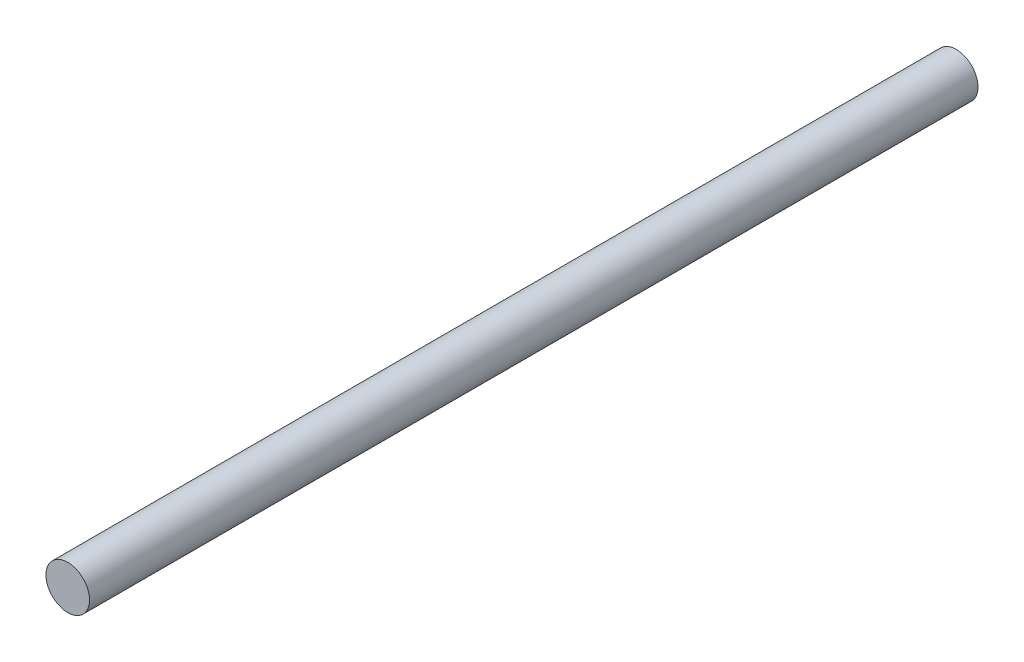
ISO-10303-21;
HEADER;
FILE_DESCRIPTION(('STEP AP214'),'2;1');
FILE_NAME('part.step','',(''),(''),'','','');
FILE_SCHEMA(('AUTOMOTIVE_DESIGN { 1 0 10303 214 1 1 1 1 }'));
ENDSEC;
DATA;
#1=APPLICATION_CONTEXT('core data for automotive mechanical design processes');
#2=APPLICATION_PROTOCOL_DEFINITION('international standard','automotive_design',2000,#1);
#3=PRODUCT_CONTEXT('',#1,'mechanical');
#4=PRODUCT('Part','Part','',(#3));
#5=PRODUCT_RELATED_PRODUCT_CATEGORY('part','',(#4));
#6=PRODUCT_DEFINITION_FORMATION('','',#4);
#7=PRODUCT_DEFINITION_CONTEXT('part definition',#1,'design');
#8=PRODUCT_DEFINITION('design','',#6,#7);
#9=PRODUCT_DEFINITION_SHAPE('','',#8);
#10=(LENGTH_UNIT() NAMED_UNIT(*) SI_UNIT(.MILLI.,.METRE.));
#11=(NAMED_UNIT(*) PLANE_ANGLE_UNIT() SI_UNIT($,.RADIAN.));
#12=(NAMED_UNIT(*) SI_UNIT($,.STERADIAN.) SOLID_ANGLE_UNIT());
#13=UNCERTAINTY_MEASURE_WITH_UNIT(LENGTH_MEASURE(1.E-05),#10,'distance_accuracy_value','');
#14=(GEOMETRIC_REPRESENTATION_CONTEXT(3) GLOBAL_UNCERTAINTY_ASSIGNED_CONTEXT((#13)) GLOBAL_UNIT_ASSIGNED_CONTEXT((#10,
#11,#12)) REPRESENTATION_CONTEXT('',''));
#15=CARTESIAN_POINT('',(0.,0.,0.));
#16=DIRECTION('',(0.,0.,1.));
#17=DIRECTION('',(1.,0.,0.));
#18=AXIS2_PLACEMENT_3D('',#15,#16,#17);
#19=CARTESIAN_POINT('',(0.,0.,139.270562748477));
#20=DIRECTION('',(0.,0.,-1.));
#21=DIRECTION('',(-1.,0.,0.));
#22=AXIS2_PLACEMENT_3D('',#19,#20,#21);
#23=CYLINDRICAL_SURFACE('',#22,6.);
#24=CARTESIAN_POINT('',(0.,0.,122.3));
#25=DIRECTION('',(0.,0.,1.));
#26=DIRECTION('',(1.,0.,0.));
#27=AXIS2_PLACEMENT_3D('',#24,#25,#26);
#28=CIRCLE('',#27,6.);
#29=CARTESIAN_POINT('',(6.,0.,122.3));
#30=VERTEX_POINT('',#29);
#31=EDGE_CURVE('E10',#30,#30,#28,.T.);
#32=ORIENTED_EDGE('',*,*,#31,.F.);
#33=EDGE_LOOP('',(#32));
#34=FACE_BOUND('',#33,.T.);
#35=CARTESIAN_POINT('',(0.,0.,-122.3));
#36=DIRECTION('',(0.,0.,1.));
#37=DIRECTION('',(1.,0.,0.));
#38=AXIS2_PLACEMENT_3D('',#35,#36,#37);
#39=CIRCLE('',#38,6.);
#40=CARTESIAN_POINT('',(6.,0.,-122.3));
#41=VERTEX_POINT('',#40);
#42=EDGE_CURVE('E39',#41,#41,#39,.T.);
#43=ORIENTED_EDGE('',*,*,#42,.T.);
#44=EDGE_LOOP('',(#43));
#45=FACE_BOUND('',#44,.T.);
#46=ADVANCED_FACE('F32',(#34,#45),#23,.T.);
#47=CARTESIAN_POINT('',(0.,-144.,122.3));
#48=DIRECTION('',(0.,0.,1.));
#49=DIRECTION('',(1.,0.,0.));
#50=AXIS2_PLACEMENT_3D('',#47,#48,#49);
#51=PLANE('',#50);
#52=ORIENTED_EDGE('',*,*,#31,.T.);
#53=EDGE_LOOP('',(#52));
#54=FACE_BOUND('',#53,.T.);
#55=ADVANCED_FACE('F34',(#54),#51,.T.);
#56=CARTESIAN_POINT('',(0.,-144.,-122.3));
#57=DIRECTION('',(0.,0.,-1.));
#58=DIRECTION('',(1.,0.,0.));
#59=AXIS2_PLACEMENT_3D('',#56,#57,#58);
#60=PLANE('',#59);
#61=ORIENTED_EDGE('',*,*,#42,.F.);
#62=EDGE_LOOP('',(#61));
#63=FACE_BOUND('',#62,.T.);
#64=ADVANCED_FACE('F46',(#63),#60,.T.);
#65=CLOSED_SHELL('',(#46,#55,#64));
#66=MANIFOLD_SOLID_BREP('B2',#65);
#67=ADVANCED_BREP_SHAPE_REPRESENTATION('',(#18,#66),#14);
#68=SHAPE_DEFINITION_REPRESENTATION(#9,#67);
ENDSEC;
END-ISO-10303-21;
